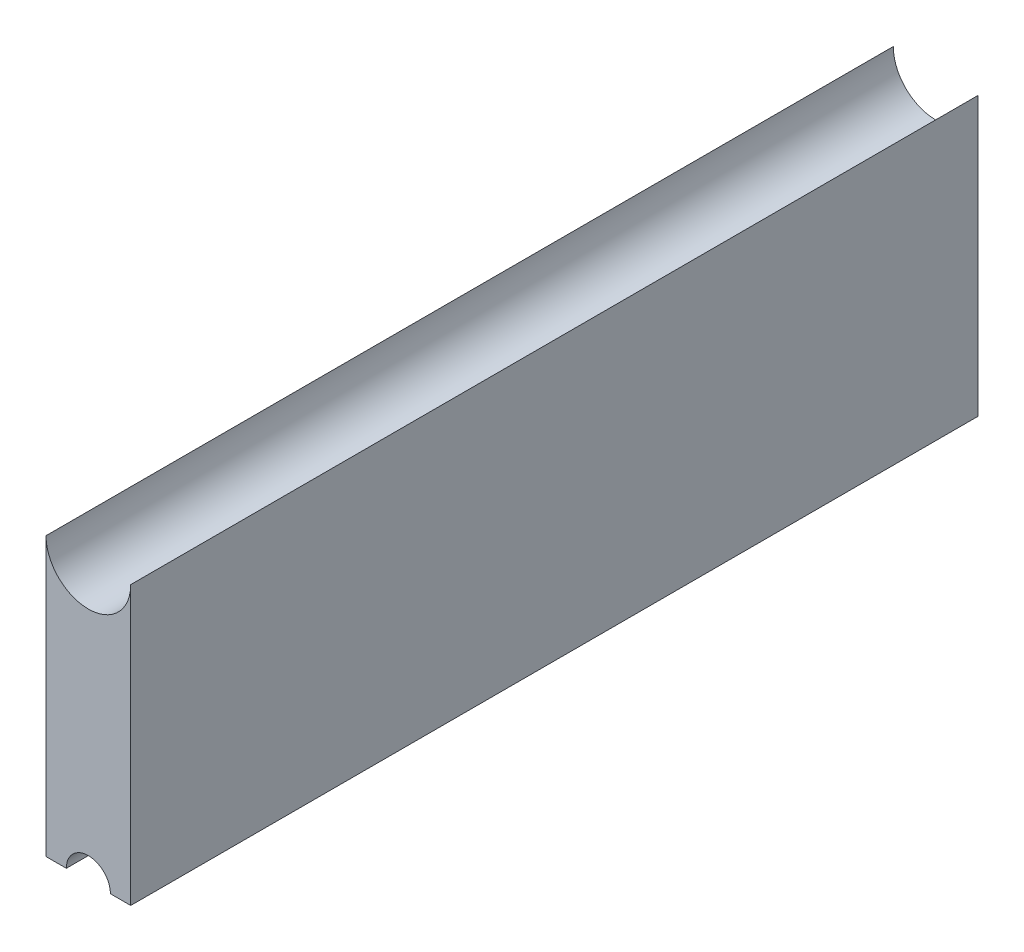
ISO-10303-21;
HEADER;
FILE_DESCRIPTION(('STEP AP214'),'2;1');
FILE_NAME('part.step','',(''),(''),'','','');
FILE_SCHEMA(('AUTOMOTIVE_DESIGN { 1 0 10303 214 1 1 1 1 }'));
ENDSEC;
DATA;
#1=APPLICATION_CONTEXT('core data for automotive mechanical design processes');
#2=APPLICATION_PROTOCOL_DEFINITION('international standard','automotive_design',2000,#1);
#3=PRODUCT_CONTEXT('',#1,'mechanical');
#4=PRODUCT('Part','Part','',(#3));
#5=PRODUCT_RELATED_PRODUCT_CATEGORY('part','',(#4));
#6=PRODUCT_DEFINITION_FORMATION('','',#4);
#7=PRODUCT_DEFINITION_CONTEXT('part definition',#1,'design');
#8=PRODUCT_DEFINITION('design','',#6,#7);
#9=PRODUCT_DEFINITION_SHAPE('','',#8);
#10=(LENGTH_UNIT() NAMED_UNIT(*) SI_UNIT(.MILLI.,.METRE.));
#11=(NAMED_UNIT(*) PLANE_ANGLE_UNIT() SI_UNIT($,.RADIAN.));
#12=(NAMED_UNIT(*) SI_UNIT($,.STERADIAN.) SOLID_ANGLE_UNIT());
#13=UNCERTAINTY_MEASURE_WITH_UNIT(LENGTH_MEASURE(1.E-05),#10,'distance_accuracy_value','');
#14=(GEOMETRIC_REPRESENTATION_CONTEXT(3) GLOBAL_UNCERTAINTY_ASSIGNED_CONTEXT((#13)) GLOBAL_UNIT_ASSIGNED_CONTEXT((#10,
#11,#12)) REPRESENTATION_CONTEXT('',''));
#15=CARTESIAN_POINT('',(0.,0.,0.));
#16=DIRECTION('',(0.,0.,1.));
#17=DIRECTION('',(1.,0.,0.));
#18=AXIS2_PLACEMENT_3D('',#15,#16,#17);
#19=CARTESIAN_POINT('',(-8.382,-29.21,63.5));
#20=DIRECTION('',(0.,0.,-1.));
#21=DIRECTION('',(-1.,0.,0.));
#22=AXIS2_PLACEMENT_3D('',#19,#20,#21);
#23=CYLINDRICAL_SURFACE('',#22,1.651);
#24=CARTESIAN_POINT('',(-8.382,-29.21,0.));
#25=DIRECTION('',(0.,0.,1.));
#26=DIRECTION('',(1.,0.,0.));
#27=AXIS2_PLACEMENT_3D('',#24,#25,#26);
#28=CIRCLE('',#27,1.651);
#29=CARTESIAN_POINT('',(-6.73099999999999,-29.21,0.));
#30=VERTEX_POINT('',#29);
#31=CARTESIAN_POINT('',(-10.033,-29.21,0.));
#32=VERTEX_POINT('',#31);
#33=EDGE_CURVE('E120',#30,#32,#28,.T.);
#34=ORIENTED_EDGE('',*,*,#33,.F.);
#35=DIRECTION('',(0.,0.,-1.));
#36=VECTOR('',#35,1.);
#37=CARTESIAN_POINT('',(-6.73099999999999,-29.21,63.5));
#38=LINE('',#37,#36);
#39=CARTESIAN_POINT('',(-6.73099999999999,-29.21,63.5));
#40=VERTEX_POINT('',#39);
#41=EDGE_CURVE('E11',#40,#30,#38,.T.);
#42=ORIENTED_EDGE('',*,*,#41,.F.);
#43=CARTESIAN_POINT('',(-8.382,-29.21,63.5));
#44=DIRECTION('',(0.,0.,1.));
#45=DIRECTION('',(1.,0.,0.));
#46=AXIS2_PLACEMENT_3D('',#43,#44,#45);
#47=CIRCLE('',#46,1.651);
#48=CARTESIAN_POINT('',(-10.033,-29.21,63.5));
#49=VERTEX_POINT('',#48);
#50=EDGE_CURVE('E144',#40,#49,#47,.T.);
#51=ORIENTED_EDGE('',*,*,#50,.T.);
#52=DIRECTION('',(0.,0.,-1.));
#53=VECTOR('',#52,1.);
#54=CARTESIAN_POINT('',(-10.033,-29.21,63.5));
#55=LINE('',#54,#53);
#56=EDGE_CURVE('E54',#49,#32,#55,.T.);
#57=ORIENTED_EDGE('',*,*,#56,.T.);
#58=EDGE_LOOP('',(#34,#42,#51,#57));
#59=FACE_BOUND('',#58,.T.);
#60=ADVANCED_FACE('F38',(#59),#23,.F.);
#61=CARTESIAN_POINT('',(0.,-29.21,63.5));
#62=DIRECTION('',(0.,-1.,0.));
#63=DIRECTION('',(0.,0.,-1.));
#64=AXIS2_PLACEMENT_3D('',#61,#62,#63);
#65=PLANE('',#64);
#66=DIRECTION('',(-1.,0.,0.));
#67=VECTOR('',#66,1.);
#68=CARTESIAN_POINT('',(0.,-29.21,0.));
#69=LINE('',#68,#67);
#70=CARTESIAN_POINT('',(-5.20699999999999,-29.21,0.));
#71=VERTEX_POINT('',#70);
#72=EDGE_CURVE('E122',#71,#30,#69,.T.);
#73=ORIENTED_EDGE('',*,*,#72,.F.);
#74=DIRECTION('',(0.,0.,-1.));
#75=VECTOR('',#74,1.);
#76=CARTESIAN_POINT('',(-5.20699999999999,-29.21,63.5));
#77=LINE('',#76,#75);
#78=CARTESIAN_POINT('',(-5.20699999999999,-29.21,63.5));
#79=VERTEX_POINT('',#78);
#80=EDGE_CURVE('E46',#79,#71,#77,.T.);
#81=ORIENTED_EDGE('',*,*,#80,.F.);
#82=DIRECTION('',(-1.,0.,0.));
#83=VECTOR('',#82,1.);
#84=CARTESIAN_POINT('',(0.,-29.21,63.5));
#85=LINE('',#84,#83);
#86=EDGE_CURVE('E116',#79,#40,#85,.T.);
#87=ORIENTED_EDGE('',*,*,#86,.T.);
#88=ORIENTED_EDGE('',*,*,#41,.T.);
#89=EDGE_LOOP('',(#73,#81,#87,#88));
#90=FACE_BOUND('',#89,.T.);
#91=ADVANCED_FACE('F140',(#90),#65,.T.);
#92=CARTESIAN_POINT('',(-5.207,0.,63.5));
#93=DIRECTION('',(1.,0.,0.));
#94=DIRECTION('',(0.,1.,0.));
#95=AXIS2_PLACEMENT_3D('',#92,#93,#94);
#96=PLANE('',#95);
#97=DIRECTION('',(0.,-1.,0.));
#98=VECTOR('',#97,1.);
#99=CARTESIAN_POINT('',(-5.207,0.,0.));
#100=LINE('',#99,#98);
#101=CARTESIAN_POINT('',(-5.207,-8.382,0.));
#102=VERTEX_POINT('',#101);
#103=EDGE_CURVE('E125',#102,#71,#100,.T.);
#104=ORIENTED_EDGE('',*,*,#103,.F.);
#105=DIRECTION('',(0.,0.,-1.));
#106=VECTOR('',#105,1.);
#107=CARTESIAN_POINT('',(-5.207,-8.382,63.5));
#108=LINE('',#107,#106);
#109=CARTESIAN_POINT('',(-5.207,-8.382,63.5));
#110=VERTEX_POINT('',#109);
#111=EDGE_CURVE('E102',#110,#102,#108,.T.);
#112=ORIENTED_EDGE('',*,*,#111,.F.);
#113=DIRECTION('',(0.,-1.,0.));
#114=VECTOR('',#113,1.);
#115=CARTESIAN_POINT('',(-5.207,0.,63.5));
#116=LINE('',#115,#114);
#117=EDGE_CURVE('E114',#110,#79,#116,.T.);
#118=ORIENTED_EDGE('',*,*,#117,.T.);
#119=ORIENTED_EDGE('',*,*,#80,.T.);
#120=EDGE_LOOP('',(#104,#112,#118,#119));
#121=FACE_BOUND('',#120,.T.);
#122=ADVANCED_FACE('F137',(#121),#96,.T.);
#123=CARTESIAN_POINT('',(-8.382,-8.382,63.5));
#124=DIRECTION('',(0.,0.,-1.));
#125=DIRECTION('',(-1.,0.,0.));
#126=AXIS2_PLACEMENT_3D('',#123,#124,#125);
#127=CYLINDRICAL_SURFACE('',#126,3.175);
#128=CARTESIAN_POINT('',(-8.382,-8.382,0.));
#129=DIRECTION('',(0.,0.,1.));
#130=DIRECTION('',(1.,0.,0.));
#131=AXIS2_PLACEMENT_3D('',#128,#129,#130);
#132=CIRCLE('',#131,3.175);
#133=CARTESIAN_POINT('',(-11.557,-8.382,0.));
#134=VERTEX_POINT('',#133);
#135=EDGE_CURVE('E99',#134,#102,#132,.T.);
#136=ORIENTED_EDGE('',*,*,#135,.F.);
#137=DIRECTION('',(0.,0.,-1.));
#138=VECTOR('',#137,1.);
#139=CARTESIAN_POINT('',(-11.557,-8.382,63.5));
#140=LINE('',#139,#138);
#141=CARTESIAN_POINT('',(-11.557,-8.382,63.5));
#142=VERTEX_POINT('',#141);
#143=EDGE_CURVE('E93',#142,#134,#140,.T.);
#144=ORIENTED_EDGE('',*,*,#143,.F.);
#145=CARTESIAN_POINT('',(-8.382,-8.382,63.5));
#146=DIRECTION('',(0.,0.,1.));
#147=DIRECTION('',(1.,0.,0.));
#148=AXIS2_PLACEMENT_3D('',#145,#146,#147);
#149=CIRCLE('',#148,3.175);
#150=EDGE_CURVE('E97',#142,#110,#149,.T.);
#151=ORIENTED_EDGE('',*,*,#150,.T.);
#152=ORIENTED_EDGE('',*,*,#111,.T.);
#153=EDGE_LOOP('',(#136,#144,#151,#152));
#154=FACE_BOUND('',#153,.T.);
#155=ADVANCED_FACE('F95',(#154),#127,.F.);
#156=CARTESIAN_POINT('',(-11.557,0.,63.5));
#157=DIRECTION('',(1.,0.,0.));
#158=DIRECTION('',(0.,1.,0.));
#159=AXIS2_PLACEMENT_3D('',#156,#157,#158);
#160=PLANE('',#159);
#161=DIRECTION('',(0.,-1.,0.));
#162=VECTOR('',#161,1.);
#163=CARTESIAN_POINT('',(-11.557,0.,0.));
#164=LINE('',#163,#162);
#165=CARTESIAN_POINT('',(-11.557,-29.21,0.));
#166=VERTEX_POINT('',#165);
#167=EDGE_CURVE('E130',#134,#166,#164,.T.);
#168=ORIENTED_EDGE('',*,*,#167,.T.);
#169=DIRECTION('',(0.,0.,-1.));
#170=VECTOR('',#169,1.);
#171=CARTESIAN_POINT('',(-11.557,-29.21,63.5));
#172=LINE('',#171,#170);
#173=CARTESIAN_POINT('',(-11.557,-29.21,63.5));
#174=VERTEX_POINT('',#173);
#175=EDGE_CURVE('E74',#174,#166,#172,.T.);
#176=ORIENTED_EDGE('',*,*,#175,.F.);
#177=DIRECTION('',(0.,-1.,0.));
#178=VECTOR('',#177,1.);
#179=CARTESIAN_POINT('',(-11.557,0.,63.5));
#180=LINE('',#179,#178);
#181=EDGE_CURVE('E104',#142,#174,#180,.T.);
#182=ORIENTED_EDGE('',*,*,#181,.F.);
#183=ORIENTED_EDGE('',*,*,#143,.T.);
#184=EDGE_LOOP('',(#168,#176,#182,#183));
#185=FACE_BOUND('',#184,.T.);
#186=ADVANCED_FACE('F105',(#185),#160,.F.);
#187=EDGE_CURVE('E126',#32,#166,#69,.T.);
#188=ORIENTED_EDGE('',*,*,#187,.F.);
#189=ORIENTED_EDGE('',*,*,#56,.F.);
#190=EDGE_CURVE('E108',#49,#174,#85,.T.);
#191=ORIENTED_EDGE('',*,*,#190,.T.);
#192=ORIENTED_EDGE('',*,*,#175,.T.);
#193=EDGE_LOOP('',(#188,#189,#191,#192));
#194=FACE_BOUND('',#193,.T.);
#195=ADVANCED_FACE('F146',(#194),#65,.T.);
#196=CARTESIAN_POINT('',(0.,0.,63.5));
#197=DIRECTION('',(0.,0.,1.));
#198=DIRECTION('',(1.,0.,0.));
#199=AXIS2_PLACEMENT_3D('',#196,#197,#198);
#200=PLANE('',#199);
#201=ORIENTED_EDGE('',*,*,#50,.F.);
#202=ORIENTED_EDGE('',*,*,#86,.F.);
#203=ORIENTED_EDGE('',*,*,#117,.F.);
#204=ORIENTED_EDGE('',*,*,#150,.F.);
#205=ORIENTED_EDGE('',*,*,#181,.T.);
#206=ORIENTED_EDGE('',*,*,#190,.F.);
#207=EDGE_LOOP('',(#201,#202,#203,#204,#205,#206));
#208=FACE_BOUND('',#207,.T.);
#209=ADVANCED_FACE('F111',(#208),#200,.T.);
#210=CARTESIAN_POINT('',(0.,0.,0.));
#211=DIRECTION('',(0.,0.,1.));
#212=DIRECTION('',(1.,0.,0.));
#213=AXIS2_PLACEMENT_3D('',#210,#211,#212);
#214=PLANE('',#213);
#215=ORIENTED_EDGE('',*,*,#33,.T.);
#216=ORIENTED_EDGE('',*,*,#187,.T.);
#217=ORIENTED_EDGE('',*,*,#167,.F.);
#218=ORIENTED_EDGE('',*,*,#135,.T.);
#219=ORIENTED_EDGE('',*,*,#103,.T.);
#220=ORIENTED_EDGE('',*,*,#72,.T.);
#221=EDGE_LOOP('',(#215,#216,#217,#218,#219,#220));
#222=FACE_BOUND('',#221,.T.);
#223=ADVANCED_FACE('F142',(#222),#214,.F.);
#224=CLOSED_SHELL('',(#60,#91,#122,#155,#186,#195,#209,#223));
#225=MANIFOLD_SOLID_BREP('B2',#224);
#226=ADVANCED_BREP_SHAPE_REPRESENTATION('',(#18,#225),#14);
#227=SHAPE_DEFINITION_REPRESENTATION(#9,#226);
ENDSEC;
END-ISO-10303-21;
